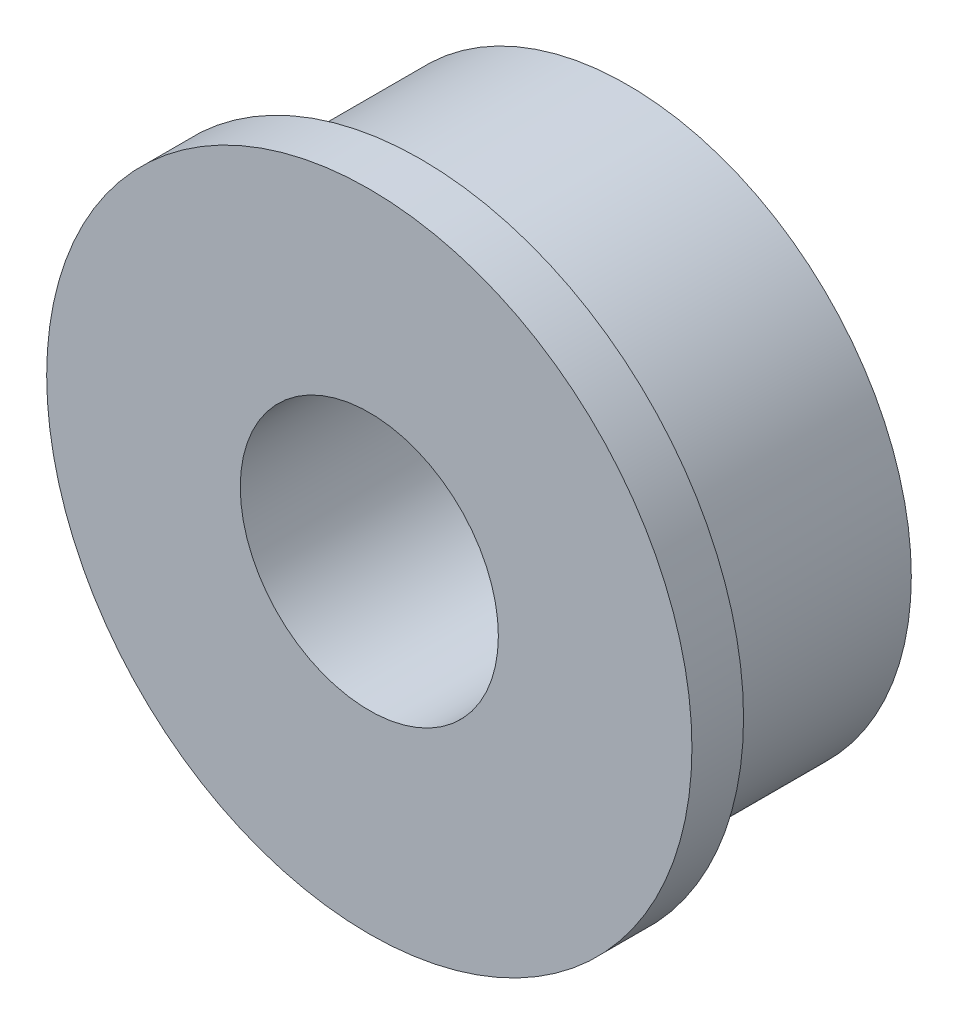
ISO-10303-21;
HEADER;
FILE_DESCRIPTION(('STEP AP214'),'2;1');
FILE_NAME('part.step','',(''),(''),'','','');
FILE_SCHEMA(('AUTOMOTIVE_DESIGN { 1 0 10303 214 1 1 1 1 }'));
ENDSEC;
DATA;
#1=APPLICATION_CONTEXT('core data for automotive mechanical design processes');
#2=APPLICATION_PROTOCOL_DEFINITION('international standard','automotive_design',2000,#1);
#3=PRODUCT_CONTEXT('',#1,'mechanical');
#4=PRODUCT('Part','Part','',(#3));
#5=PRODUCT_RELATED_PRODUCT_CATEGORY('part','',(#4));
#6=PRODUCT_DEFINITION_FORMATION('','',#4);
#7=PRODUCT_DEFINITION_CONTEXT('part definition',#1,'design');
#8=PRODUCT_DEFINITION('design','',#6,#7);
#9=PRODUCT_DEFINITION_SHAPE('','',#8);
#10=(LENGTH_UNIT() NAMED_UNIT(*) SI_UNIT(.MILLI.,.METRE.));
#11=(NAMED_UNIT(*) PLANE_ANGLE_UNIT() SI_UNIT($,.RADIAN.));
#12=(NAMED_UNIT(*) SI_UNIT($,.STERADIAN.) SOLID_ANGLE_UNIT());
#13=UNCERTAINTY_MEASURE_WITH_UNIT(LENGTH_MEASURE(1.E-05),#10,'distance_accuracy_value','');
#14=(GEOMETRIC_REPRESENTATION_CONTEXT(3) GLOBAL_UNCERTAINTY_ASSIGNED_CONTEXT((#13)) GLOBAL_UNIT_ASSIGNED_CONTEXT((#10,
#11,#12)) REPRESENTATION_CONTEXT('',''));
#15=CARTESIAN_POINT('',(0.,0.,0.));
#16=DIRECTION('',(0.,0.,1.));
#17=DIRECTION('',(1.,0.,0.));
#18=AXIS2_PLACEMENT_3D('',#15,#16,#17);
#19=CARTESIAN_POINT('',(0.,0.,0.));
#20=DIRECTION('',(0.,0.,1.));
#21=DIRECTION('',(1.,0.,0.));
#22=AXIS2_PLACEMENT_3D('',#19,#20,#21);
#23=PLANE('',#22);
#24=CARTESIAN_POINT('',(0.,0.,0.));
#25=DIRECTION('',(0.,0.,1.));
#26=DIRECTION('',(1.,0.,0.));
#27=AXIS2_PLACEMENT_3D('',#24,#25,#26);
#28=CIRCLE('',#27,5.5);
#29=CARTESIAN_POINT('',(5.5,0.,0.));
#30=VERTEX_POINT('',#29);
#31=EDGE_CURVE('E36',#30,#30,#28,.T.);
#32=ORIENTED_EDGE('',*,*,#31,.F.);
#33=EDGE_LOOP('',(#32));
#34=FACE_BOUND('',#33,.T.);
#35=CARTESIAN_POINT('',(0.,0.,0.));
#36=DIRECTION('',(0.,0.,1.));
#37=DIRECTION('',(1.,0.,0.));
#38=AXIS2_PLACEMENT_3D('',#35,#36,#37);
#39=CIRCLE('',#38,2.5);
#40=CARTESIAN_POINT('',(2.5,0.,0.));
#41=VERTEX_POINT('',#40);
#42=EDGE_CURVE('E43',#41,#41,#39,.T.);
#43=ORIENTED_EDGE('',*,*,#42,.T.);
#44=EDGE_LOOP('',(#43));
#45=FACE_BOUND('',#44,.T.);
#46=ADVANCED_FACE('F32',(#34,#45),#23,.F.);
#47=CARTESIAN_POINT('',(0.,0.,4.));
#48=DIRECTION('',(0.,0.,-1.));
#49=DIRECTION('',(-1.,0.,0.));
#50=AXIS2_PLACEMENT_3D('',#47,#48,#49);
#51=CYLINDRICAL_SURFACE('',#50,5.5);
#52=CARTESIAN_POINT('',(0.,0.,4.));
#53=DIRECTION('',(0.,0.,1.));
#54=DIRECTION('',(1.,0.,0.));
#55=AXIS2_PLACEMENT_3D('',#52,#53,#54);
#56=CIRCLE('',#55,5.5);
#57=CARTESIAN_POINT('',(5.5,0.,4.));
#58=VERTEX_POINT('',#57);
#59=EDGE_CURVE('E10',#58,#58,#56,.T.);
#60=ORIENTED_EDGE('',*,*,#59,.F.);
#61=EDGE_LOOP('',(#60));
#62=FACE_BOUND('',#61,.T.);
#63=ORIENTED_EDGE('',*,*,#31,.T.);
#64=EDGE_LOOP('',(#63));
#65=FACE_BOUND('',#64,.T.);
#66=ADVANCED_FACE('F34',(#62,#65),#51,.T.);
#67=CARTESIAN_POINT('',(0.,0.,4.));
#68=DIRECTION('',(0.,0.,-1.));
#69=DIRECTION('',(-1.,0.,0.));
#70=AXIS2_PLACEMENT_3D('',#67,#68,#69);
#71=CYLINDRICAL_SURFACE('',#70,2.5);
#72=ORIENTED_EDGE('',*,*,#42,.F.);
#73=EDGE_LOOP('',(#72));
#74=FACE_BOUND('',#73,.T.);
#75=CARTESIAN_POINT('',(0.,0.,5.));
#76=DIRECTION('',(0.,0.,1.));
#77=DIRECTION('',(1.,0.,0.));
#78=AXIS2_PLACEMENT_3D('',#75,#76,#77);
#79=CIRCLE('',#78,2.5);
#80=CARTESIAN_POINT('',(2.5,0.,5.));
#81=VERTEX_POINT('',#80);
#82=EDGE_CURVE('E51',#81,#81,#79,.T.);
#83=ORIENTED_EDGE('',*,*,#82,.T.);
#84=EDGE_LOOP('',(#83));
#85=FACE_BOUND('',#84,.T.);
#86=ADVANCED_FACE('F57',(#74,#85),#71,.F.);
#87=CARTESIAN_POINT('',(0.,0.,4.));
#88=DIRECTION('',(0.,0.,1.));
#89=DIRECTION('',(1.,0.,0.));
#90=AXIS2_PLACEMENT_3D('',#87,#88,#89);
#91=PLANE('',#90);
#92=CARTESIAN_POINT('',(0.,0.,4.));
#93=DIRECTION('',(0.,0.,1.));
#94=DIRECTION('',(1.,0.,0.));
#95=AXIS2_PLACEMENT_3D('',#92,#93,#94);
#96=CIRCLE('',#95,6.25);
#97=CARTESIAN_POINT('',(6.25,0.,4.));
#98=VERTEX_POINT('',#97);
#99=EDGE_CURVE('E48',#98,#98,#96,.T.);
#100=ORIENTED_EDGE('',*,*,#99,.F.);
#101=EDGE_LOOP('',(#100));
#102=FACE_BOUND('',#101,.T.);
#103=ORIENTED_EDGE('',*,*,#59,.T.);
#104=EDGE_LOOP('',(#103));
#105=FACE_BOUND('',#104,.T.);
#106=ADVANCED_FACE('F62',(#102,#105),#91,.F.);
#107=CARTESIAN_POINT('',(0.,0.,5.));
#108=DIRECTION('',(0.,0.,1.));
#109=DIRECTION('',(1.,0.,0.));
#110=AXIS2_PLACEMENT_3D('',#107,#108,#109);
#111=PLANE('',#110);
#112=CARTESIAN_POINT('',(0.,0.,5.));
#113=DIRECTION('',(0.,0.,1.));
#114=DIRECTION('',(1.,0.,0.));
#115=AXIS2_PLACEMENT_3D('',#112,#113,#114);
#116=CIRCLE('',#115,6.25);
#117=CARTESIAN_POINT('',(6.25,0.,5.));
#118=VERTEX_POINT('',#117);
#119=EDGE_CURVE('E47',#118,#118,#116,.T.);
#120=ORIENTED_EDGE('',*,*,#119,.T.);
#121=EDGE_LOOP('',(#120));
#122=FACE_BOUND('',#121,.T.);
#123=ORIENTED_EDGE('',*,*,#82,.F.);
#124=EDGE_LOOP('',(#123));
#125=FACE_BOUND('',#124,.T.);
#126=ADVANCED_FACE('F59',(#122,#125),#111,.T.);
#127=CARTESIAN_POINT('',(0.,0.,5.));
#128=DIRECTION('',(0.,0.,-1.));
#129=DIRECTION('',(-1.,0.,0.));
#130=AXIS2_PLACEMENT_3D('',#127,#128,#129);
#131=CYLINDRICAL_SURFACE('',#130,6.25);
#132=ORIENTED_EDGE('',*,*,#119,.F.);
#133=EDGE_LOOP('',(#132));
#134=FACE_BOUND('',#133,.T.);
#135=ORIENTED_EDGE('',*,*,#99,.T.);
#136=EDGE_LOOP('',(#135));
#137=FACE_BOUND('',#136,.T.);
#138=ADVANCED_FACE('F61',(#134,#137),#131,.T.);
#139=CLOSED_SHELL('',(#46,#66,#86,#106,#126,#138));
#140=MANIFOLD_SOLID_BREP('B2',#139);
#141=ADVANCED_BREP_SHAPE_REPRESENTATION('',(#18,#140),#14);
#142=SHAPE_DEFINITION_REPRESENTATION(#9,#141);
ENDSEC;
END-ISO-10303-21;
